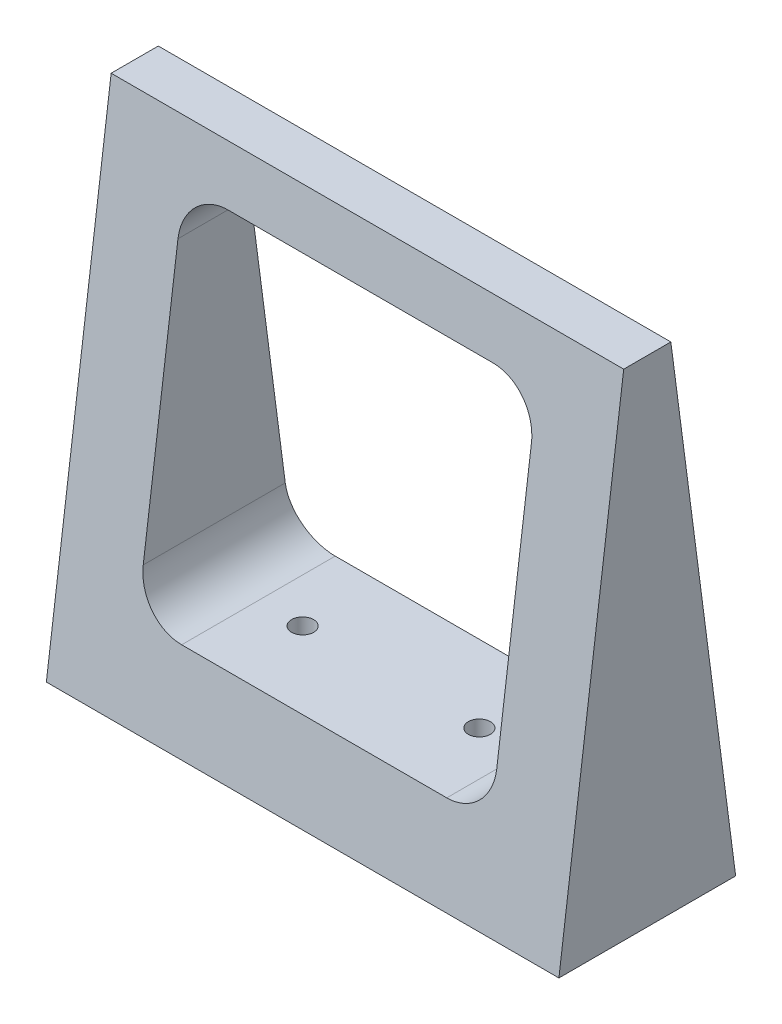
ISO-10303-21;
HEADER;
FILE_DESCRIPTION(('STEP AP214'),'2;1');
FILE_NAME('part.step','',(''),(''),'','','');
FILE_SCHEMA(('AUTOMOTIVE_DESIGN { 1 0 10303 214 1 1 1 1 }'));
ENDSEC;
DATA;
#1=APPLICATION_CONTEXT('core data for automotive mechanical design processes');
#2=APPLICATION_PROTOCOL_DEFINITION('international standard','automotive_design',2000,#1);
#3=PRODUCT_CONTEXT('',#1,'mechanical');
#4=PRODUCT('Part','Part','',(#3));
#5=PRODUCT_RELATED_PRODUCT_CATEGORY('part','',(#4));
#6=PRODUCT_DEFINITION_FORMATION('','',#4);
#7=PRODUCT_DEFINITION_CONTEXT('part definition',#1,'design');
#8=PRODUCT_DEFINITION('design','',#6,#7);
#9=PRODUCT_DEFINITION_SHAPE('','',#8);
#10=(LENGTH_UNIT() NAMED_UNIT(*) SI_UNIT(.MILLI.,.METRE.));
#11=(NAMED_UNIT(*) PLANE_ANGLE_UNIT() SI_UNIT($,.RADIAN.));
#12=(NAMED_UNIT(*) SI_UNIT($,.STERADIAN.) SOLID_ANGLE_UNIT());
#13=UNCERTAINTY_MEASURE_WITH_UNIT(LENGTH_MEASURE(1.E-05),#10,'distance_accuracy_value','');
#14=(GEOMETRIC_REPRESENTATION_CONTEXT(3) GLOBAL_UNCERTAINTY_ASSIGNED_CONTEXT((#13)) GLOBAL_UNIT_ASSIGNED_CONTEXT((#10,
#11,#12)) REPRESENTATION_CONTEXT('',''));
#15=CARTESIAN_POINT('',(0.,0.,0.));
#16=DIRECTION('',(0.,0.,1.));
#17=DIRECTION('',(1.,0.,0.));
#18=AXIS2_PLACEMENT_3D('',#15,#16,#17);
#19=CARTESIAN_POINT('',(92.075,177.8,8.46666666666667));
#20=DIRECTION('',(0.,-0.129843798506472,-0.991534461322152));
#21=DIRECTION('',(0.,0.991534461322152,-0.129843798506472));
#22=AXIS2_PLACEMENT_3D('',#19,#20,#21);
#23=PLANE('',#22);
#24=DIRECTION('',(-1.,0.,0.));
#25=VECTOR('',#24,1.);
#26=CARTESIAN_POINT('',(92.075,31.75,27.5922619047619));
#27=LINE('',#26,#25);
#28=CARTESIAN_POINT('',(47.625,31.75,27.5922619047619));
#29=VERTEX_POINT('',#28);
#30=CARTESIAN_POINT('',(-47.625,31.75,27.5922619047619));
#31=VERTEX_POINT('',#30);
#32=EDGE_CURVE('E175',#29,#31,#27,.T.);
#33=ORIENTED_EDGE('',*,*,#32,.T.);
#34=CARTESIAN_POINT('',(-47.625,47.625,25.5133928571429));
#35=DIRECTION('',(0.,-0.129843798506472,-0.991534461322152));
#36=DIRECTION('',(0.,-0.991534461322152,0.129843798506472));
#37=AXIS2_PLACEMENT_3D('',#34,#35,#36);
#38=ELLIPSE('',#37,16.0105378272296,15.875);
#39=CARTESIAN_POINT('',(-63.5,47.625,25.5133928571428));
#40=VERTEX_POINT('',#39);
#41=EDGE_CURVE('E138',#31,#40,#38,.T.);
#42=ORIENTED_EDGE('',*,*,#41,.T.);
#43=DIRECTION('',(0.,0.991534461322152,-0.129843798506472));
#44=VECTOR('',#43,1.);
#45=CARTESIAN_POINT('',(-63.5,177.8,8.46666666666667));
#46=LINE('',#45,#44);
#47=CARTESIAN_POINT('',(-63.5,142.875,13.0401785714286));
#48=VERTEX_POINT('',#47);
#49=EDGE_CURVE('E204',#40,#48,#46,.T.);
#50=ORIENTED_EDGE('',*,*,#49,.T.);
#51=CARTESIAN_POINT('',(-47.625,142.875,13.0401785714286));
#52=DIRECTION('',(0.,-0.129843798506472,-0.991534461322152));
#53=DIRECTION('',(0.,-0.991534461322152,0.129843798506472));
#54=AXIS2_PLACEMENT_3D('',#51,#52,#53);
#55=ELLIPSE('',#54,16.0105378272296,15.875);
#56=CARTESIAN_POINT('',(-47.625,158.75,10.9613095238095));
#57=VERTEX_POINT('',#56);
#58=EDGE_CURVE('E203',#48,#57,#55,.T.);
#59=ORIENTED_EDGE('',*,*,#58,.T.);
#60=DIRECTION('',(1.,0.,0.));
#61=VECTOR('',#60,1.);
#62=CARTESIAN_POINT('',(92.075,158.75,10.9613095238095));
#63=LINE('',#62,#61);
#64=CARTESIAN_POINT('',(47.625,158.75,10.9613095238095));
#65=VERTEX_POINT('',#64);
#66=EDGE_CURVE('E196',#57,#65,#63,.T.);
#67=ORIENTED_EDGE('',*,*,#66,.T.);
#68=CARTESIAN_POINT('',(47.625,142.875,13.0401785714286));
#69=DIRECTION('',(0.,-0.129843798506472,-0.991534461322152));
#70=DIRECTION('',(0.,-0.991534461322152,0.129843798506472));
#71=AXIS2_PLACEMENT_3D('',#68,#69,#70);
#72=ELLIPSE('',#71,16.0105378272296,15.875);
#73=CARTESIAN_POINT('',(63.5,142.875,13.0401785714286));
#74=VERTEX_POINT('',#73);
#75=EDGE_CURVE('E193',#65,#74,#72,.T.);
#76=ORIENTED_EDGE('',*,*,#75,.T.);
#77=DIRECTION('',(0.,-0.991534461322152,0.129843798506472));
#78=VECTOR('',#77,1.);
#79=CARTESIAN_POINT('',(63.5,177.8,8.46666666666667));
#80=LINE('',#79,#78);
#81=CARTESIAN_POINT('',(63.5,47.625,25.5133928571428));
#82=VERTEX_POINT('',#81);
#83=EDGE_CURVE('E194',#74,#82,#80,.T.);
#84=ORIENTED_EDGE('',*,*,#83,.T.);
#85=CARTESIAN_POINT('',(47.625,47.625,25.5133928571429));
#86=DIRECTION('',(0.,-0.129843798506472,-0.991534461322152));
#87=DIRECTION('',(0.,-0.991534461322152,0.129843798506472));
#88=AXIS2_PLACEMENT_3D('',#85,#86,#87);
#89=ELLIPSE('',#88,16.0105378272296,15.875);
#90=EDGE_CURVE('E188',#82,#29,#89,.T.);
#91=ORIENTED_EDGE('',*,*,#90,.T.);
#92=EDGE_LOOP('',(#33,#42,#50,#59,#67,#76,#84,#91));
#93=FACE_BOUND('',#92,.T.);
#94=DIRECTION('',(0.,-0.991534461322152,0.129843798506472));
#95=VECTOR('',#94,1.);
#96=CARTESIAN_POINT('',(-92.075,177.8,8.46666666666667));
#97=LINE('',#96,#95);
#98=CARTESIAN_POINT('',(-92.075,177.8,8.46666666666667));
#99=VERTEX_POINT('',#98);
#100=CARTESIAN_POINT('',(-92.075,0.,31.75));
#101=VERTEX_POINT('',#100);
#102=EDGE_CURVE('E208',#99,#101,#97,.T.);
#103=ORIENTED_EDGE('',*,*,#102,.T.);
#104=DIRECTION('',(-1.,0.,0.));
#105=VECTOR('',#104,1.);
#106=CARTESIAN_POINT('',(92.075,0.,31.75));
#107=LINE('',#106,#105);
#108=CARTESIAN_POINT('',(92.075,0.,31.75));
#109=VERTEX_POINT('',#108);
#110=EDGE_CURVE('E132',#109,#101,#107,.T.);
#111=ORIENTED_EDGE('',*,*,#110,.F.);
#112=DIRECTION('',(0.,-0.991534461322152,0.129843798506472));
#113=VECTOR('',#112,1.);
#114=CARTESIAN_POINT('',(92.075,177.8,8.46666666666667));
#115=LINE('',#114,#113);
#116=CARTESIAN_POINT('',(92.075,177.8,8.46666666666667));
#117=VERTEX_POINT('',#116);
#118=EDGE_CURVE('E207',#117,#109,#115,.T.);
#119=ORIENTED_EDGE('',*,*,#118,.F.);
#120=DIRECTION('',(-1.,0.,0.));
#121=VECTOR('',#120,1.);
#122=CARTESIAN_POINT('',(92.075,177.8,8.46666666666667));
#123=LINE('',#122,#121);
#124=EDGE_CURVE('E218',#117,#99,#123,.T.);
#125=ORIENTED_EDGE('',*,*,#124,.T.);
#126=EDGE_LOOP('',(#103,#111,#119,#125));
#127=FACE_BOUND('',#126,.T.);
#128=ADVANCED_FACE('F41',(#93,#127),#23,.F.);
#129=CARTESIAN_POINT('',(92.075,0.,31.75));
#130=DIRECTION('',(0.,1.,0.));
#131=DIRECTION('',(0.,0.,1.));
#132=AXIS2_PLACEMENT_3D('',#129,#130,#131);
#133=PLANE('',#132);
#134=CARTESIAN_POINT('',(-31.75,0.,0.));
#135=DIRECTION('',(0.,1.,0.));
#136=DIRECTION('',(0.,0.,1.));
#137=AXIS2_PLACEMENT_3D('',#134,#135,#136);
#138=CIRCLE('',#137,3.96875);
#139=CARTESIAN_POINT('',(-31.75,0.,3.96875));
#140=VERTEX_POINT('',#139);
#141=EDGE_CURVE('E142',#140,#140,#138,.T.);
#142=ORIENTED_EDGE('',*,*,#141,.T.);
#143=EDGE_LOOP('',(#142));
#144=FACE_BOUND('',#143,.T.);
#145=CARTESIAN_POINT('',(31.75,0.,0.));
#146=DIRECTION('',(0.,1.,0.));
#147=DIRECTION('',(0.,0.,1.));
#148=AXIS2_PLACEMENT_3D('',#145,#146,#147);
#149=CIRCLE('',#148,3.96875);
#150=CARTESIAN_POINT('',(31.75,0.,3.96875));
#151=VERTEX_POINT('',#150);
#152=EDGE_CURVE('E157',#151,#151,#149,.T.);
#153=ORIENTED_EDGE('',*,*,#152,.T.);
#154=EDGE_LOOP('',(#153));
#155=FACE_BOUND('',#154,.T.);
#156=DIRECTION('',(0.,0.,-1.));
#157=VECTOR('',#156,1.);
#158=CARTESIAN_POINT('',(-92.075,0.,31.75));
#159=LINE('',#158,#157);
#160=CARTESIAN_POINT('',(-92.075,0.,-31.75));
#161=VERTEX_POINT('',#160);
#162=EDGE_CURVE('E225',#101,#161,#159,.T.);
#163=ORIENTED_EDGE('',*,*,#162,.T.);
#164=DIRECTION('',(-1.,0.,0.));
#165=VECTOR('',#164,1.);
#166=CARTESIAN_POINT('',(92.075,0.,-31.75));
#167=LINE('',#166,#165);
#168=CARTESIAN_POINT('',(92.075,0.,-31.75));
#169=VERTEX_POINT('',#168);
#170=EDGE_CURVE('E234',#169,#161,#167,.T.);
#171=ORIENTED_EDGE('',*,*,#170,.F.);
#172=DIRECTION('',(0.,0.,-1.));
#173=VECTOR('',#172,1.);
#174=CARTESIAN_POINT('',(92.075,0.,31.75));
#175=LINE('',#174,#173);
#176=EDGE_CURVE('E215',#109,#169,#175,.T.);
#177=ORIENTED_EDGE('',*,*,#176,.F.);
#178=ORIENTED_EDGE('',*,*,#110,.T.);
#179=EDGE_LOOP('',(#163,#171,#177,#178));
#180=FACE_BOUND('',#179,.T.);
#181=ADVANCED_FACE('F267',(#144,#155,#180),#133,.F.);
#182=CARTESIAN_POINT('',(92.075,0.,-31.75));
#183=DIRECTION('',(0.,-0.129843798506472,0.991534461322152));
#184=DIRECTION('',(0.,-0.991534461322152,-0.129843798506472));
#185=AXIS2_PLACEMENT_3D('',#182,#183,#184);
#186=PLANE('',#185);
#187=DIRECTION('',(0.,-0.991534461322152,-0.129843798506472));
#188=VECTOR('',#187,1.);
#189=CARTESIAN_POINT('',(-63.5,0.,-31.75));
#190=LINE('',#189,#188);
#191=CARTESIAN_POINT('',(-63.5,142.875,-13.0401785714286));
#192=VERTEX_POINT('',#191);
#193=CARTESIAN_POINT('',(-63.5,47.625,-25.5133928571429));
#194=VERTEX_POINT('',#193);
#195=EDGE_CURVE('E47',#192,#194,#190,.T.);
#196=ORIENTED_EDGE('',*,*,#195,.T.);
#197=CARTESIAN_POINT('',(-47.625,47.625,-25.5133928571429));
#198=DIRECTION('',(0.,-0.129843798506472,0.991534461322152));
#199=DIRECTION('',(0.,0.991534461322152,0.129843798506472));
#200=AXIS2_PLACEMENT_3D('',#197,#198,#199);
#201=ELLIPSE('',#200,16.0105378272296,15.875);
#202=CARTESIAN_POINT('',(-47.625,31.75,-27.5922619047619));
#203=VERTEX_POINT('',#202);
#204=EDGE_CURVE('E11',#194,#203,#201,.T.);
#205=ORIENTED_EDGE('',*,*,#204,.T.);
#206=DIRECTION('',(1.,0.,0.));
#207=VECTOR('',#206,1.);
#208=CARTESIAN_POINT('',(92.075,31.75,-27.5922619047619));
#209=LINE('',#208,#207);
#210=CARTESIAN_POINT('',(47.625,31.75,-27.5922619047619));
#211=VERTEX_POINT('',#210);
#212=EDGE_CURVE('E126',#203,#211,#209,.T.);
#213=ORIENTED_EDGE('',*,*,#212,.T.);
#214=CARTESIAN_POINT('',(47.625,47.625,-25.5133928571429));
#215=DIRECTION('',(0.,-0.129843798506472,0.991534461322152));
#216=DIRECTION('',(0.,0.991534461322152,0.129843798506472));
#217=AXIS2_PLACEMENT_3D('',#214,#215,#216);
#218=ELLIPSE('',#217,16.0105378272296,15.875);
#219=CARTESIAN_POINT('',(63.5,47.625,-25.5133928571429));
#220=VERTEX_POINT('',#219);
#221=EDGE_CURVE('E135',#211,#220,#218,.T.);
#222=ORIENTED_EDGE('',*,*,#221,.T.);
#223=DIRECTION('',(0.,0.991534461322152,0.129843798506472));
#224=VECTOR('',#223,1.);
#225=CARTESIAN_POINT('',(63.5,0.,-31.75));
#226=LINE('',#225,#224);
#227=CARTESIAN_POINT('',(63.5,142.875,-13.0401785714286));
#228=VERTEX_POINT('',#227);
#229=EDGE_CURVE('E236',#220,#228,#226,.T.);
#230=ORIENTED_EDGE('',*,*,#229,.T.);
#231=CARTESIAN_POINT('',(47.625,142.875,-13.0401785714286));
#232=DIRECTION('',(0.,-0.129843798506472,0.991534461322152));
#233=DIRECTION('',(0.,0.991534461322152,0.129843798506472));
#234=AXIS2_PLACEMENT_3D('',#231,#232,#233);
#235=ELLIPSE('',#234,16.0105378272296,15.875);
#236=CARTESIAN_POINT('',(47.625,158.75,-10.9613095238095));
#237=VERTEX_POINT('',#236);
#238=EDGE_CURVE('E241',#228,#237,#235,.T.);
#239=ORIENTED_EDGE('',*,*,#238,.T.);
#240=DIRECTION('',(-1.,0.,0.));
#241=VECTOR('',#240,1.);
#242=CARTESIAN_POINT('',(92.075,158.75,-10.9613095238095));
#243=LINE('',#242,#241);
#244=CARTESIAN_POINT('',(-47.625,158.75,-10.9613095238096));
#245=VERTEX_POINT('',#244);
#246=EDGE_CURVE('E152',#237,#245,#243,.T.);
#247=ORIENTED_EDGE('',*,*,#246,.T.);
#248=CARTESIAN_POINT('',(-47.625,142.875,-13.0401785714286));
#249=DIRECTION('',(0.,-0.129843798506472,0.991534461322152));
#250=DIRECTION('',(0.,0.991534461322152,0.129843798506472));
#251=AXIS2_PLACEMENT_3D('',#248,#249,#250);
#252=ELLIPSE('',#251,16.0105378272296,15.875);
#253=EDGE_CURVE('E149',#245,#192,#252,.T.);
#254=ORIENTED_EDGE('',*,*,#253,.T.);
#255=EDGE_LOOP('',(#196,#205,#213,#222,#230,#239,#247,#254));
#256=FACE_BOUND('',#255,.T.);
#257=DIRECTION('',(0.,0.991534461322152,0.129843798506472));
#258=VECTOR('',#257,1.);
#259=CARTESIAN_POINT('',(-92.075,0.,-31.75));
#260=LINE('',#259,#258);
#261=CARTESIAN_POINT('',(-92.075,177.8,-8.46666666666667));
#262=VERTEX_POINT('',#261);
#263=EDGE_CURVE('E221',#161,#262,#260,.T.);
#264=ORIENTED_EDGE('',*,*,#263,.T.);
#265=DIRECTION('',(-1.,0.,0.));
#266=VECTOR('',#265,1.);
#267=CARTESIAN_POINT('',(92.075,177.8,-8.46666666666667));
#268=LINE('',#267,#266);
#269=CARTESIAN_POINT('',(92.075,177.8,-8.46666666666667));
#270=VERTEX_POINT('',#269);
#271=EDGE_CURVE('E228',#270,#262,#268,.T.);
#272=ORIENTED_EDGE('',*,*,#271,.F.);
#273=DIRECTION('',(0.,0.991534461322152,0.129843798506472));
#274=VECTOR('',#273,1.);
#275=CARTESIAN_POINT('',(92.075,0.,-31.75));
#276=LINE('',#275,#274);
#277=EDGE_CURVE('E214',#169,#270,#276,.T.);
#278=ORIENTED_EDGE('',*,*,#277,.F.);
#279=ORIENTED_EDGE('',*,*,#170,.T.);
#280=EDGE_LOOP('',(#264,#272,#278,#279));
#281=FACE_BOUND('',#280,.T.);
#282=ADVANCED_FACE('F144',(#256,#281),#186,.F.);
#283=CARTESIAN_POINT('',(92.075,177.8,-8.46666666666667));
#284=DIRECTION('',(0.,-1.,0.));
#285=DIRECTION('',(0.,0.,-1.));
#286=AXIS2_PLACEMENT_3D('',#283,#284,#285);
#287=PLANE('',#286);
#288=DIRECTION('',(0.,0.,1.));
#289=VECTOR('',#288,1.);
#290=CARTESIAN_POINT('',(-92.075,177.8,-8.46666666666667));
#291=LINE('',#290,#289);
#292=EDGE_CURVE('E213',#262,#99,#291,.T.);
#293=ORIENTED_EDGE('',*,*,#292,.T.);
#294=ORIENTED_EDGE('',*,*,#124,.F.);
#295=DIRECTION('',(0.,0.,1.));
#296=VECTOR('',#295,1.);
#297=CARTESIAN_POINT('',(92.075,177.8,-8.46666666666667));
#298=LINE('',#297,#296);
#299=EDGE_CURVE('E220',#270,#117,#298,.T.);
#300=ORIENTED_EDGE('',*,*,#299,.F.);
#301=ORIENTED_EDGE('',*,*,#271,.T.);
#302=EDGE_LOOP('',(#293,#294,#300,#301));
#303=FACE_BOUND('',#302,.T.);
#304=ADVANCED_FACE('F276',(#303),#287,.F.);
#305=CARTESIAN_POINT('',(92.075,0.,0.));
#306=DIRECTION('',(1.,0.,0.));
#307=DIRECTION('',(0.,0.,-1.));
#308=AXIS2_PLACEMENT_3D('',#305,#306,#307);
#309=PLANE('',#308);
#310=ORIENTED_EDGE('',*,*,#118,.T.);
#311=ORIENTED_EDGE('',*,*,#176,.T.);
#312=ORIENTED_EDGE('',*,*,#277,.T.);
#313=ORIENTED_EDGE('',*,*,#299,.T.);
#314=EDGE_LOOP('',(#310,#311,#312,#313));
#315=FACE_BOUND('',#314,.T.);
#316=ADVANCED_FACE('F283',(#315),#309,.T.);
#317=CARTESIAN_POINT('',(-92.075,0.,0.));
#318=DIRECTION('',(1.,0.,0.));
#319=DIRECTION('',(0.,0.,-1.));
#320=AXIS2_PLACEMENT_3D('',#317,#318,#319);
#321=PLANE('',#320);
#322=ORIENTED_EDGE('',*,*,#102,.F.);
#323=ORIENTED_EDGE('',*,*,#292,.F.);
#324=ORIENTED_EDGE('',*,*,#263,.F.);
#325=ORIENTED_EDGE('',*,*,#162,.F.);
#326=EDGE_LOOP('',(#322,#323,#324,#325));
#327=FACE_BOUND('',#326,.T.);
#328=ADVANCED_FACE('F287',(#327),#321,.F.);
#329=CARTESIAN_POINT('',(-47.625,47.625,-79.375));
#330=DIRECTION('',(0.,0.,1.));
#331=DIRECTION('',(1.,0.,0.));
#332=AXIS2_PLACEMENT_3D('',#329,#330,#331);
#333=CYLINDRICAL_SURFACE('',#332,15.875);
#334=DIRECTION('',(0.,0.,1.));
#335=VECTOR('',#334,1.);
#336=CARTESIAN_POINT('',(-47.625,31.75,-79.375));
#337=LINE('',#336,#335);
#338=EDGE_CURVE('E60',#203,#31,#337,.T.);
#339=ORIENTED_EDGE('',*,*,#338,.F.);
#340=ORIENTED_EDGE('',*,*,#204,.F.);
#341=DIRECTION('',(0.,0.,1.));
#342=VECTOR('',#341,1.);
#343=CARTESIAN_POINT('',(-63.5,47.625,-79.375));
#344=LINE('',#343,#342);
#345=EDGE_CURVE('E168',#194,#40,#344,.T.);
#346=ORIENTED_EDGE('',*,*,#345,.T.);
#347=ORIENTED_EDGE('',*,*,#41,.F.);
#348=EDGE_LOOP('',(#339,#340,#346,#347));
#349=FACE_BOUND('',#348,.T.);
#350=ADVANCED_FACE('F137',(#349),#333,.F.);
#351=CARTESIAN_POINT('',(-63.5,142.875,-79.375));
#352=DIRECTION('',(-1.,0.,0.));
#353=DIRECTION('',(0.,0.,1.));
#354=AXIS2_PLACEMENT_3D('',#351,#352,#353);
#355=PLANE('',#354);
#356=ORIENTED_EDGE('',*,*,#345,.F.);
#357=ORIENTED_EDGE('',*,*,#195,.F.);
#358=DIRECTION('',(0.,0.,1.));
#359=VECTOR('',#358,1.);
#360=CARTESIAN_POINT('',(-63.5,142.875,-79.375));
#361=LINE('',#360,#359);
#362=EDGE_CURVE('E172',#192,#48,#361,.T.);
#363=ORIENTED_EDGE('',*,*,#362,.T.);
#364=ORIENTED_EDGE('',*,*,#49,.F.);
#365=EDGE_LOOP('',(#356,#357,#363,#364));
#366=FACE_BOUND('',#365,.T.);
#367=ADVANCED_FACE('F255',(#366),#355,.F.);
#368=CARTESIAN_POINT('',(-47.625,142.875,-79.375));
#369=DIRECTION('',(0.,0.,1.));
#370=DIRECTION('',(1.,0.,0.));
#371=AXIS2_PLACEMENT_3D('',#368,#369,#370);
#372=CYLINDRICAL_SURFACE('',#371,15.875);
#373=ORIENTED_EDGE('',*,*,#362,.F.);
#374=ORIENTED_EDGE('',*,*,#253,.F.);
#375=DIRECTION('',(0.,0.,1.));
#376=VECTOR('',#375,1.);
#377=CARTESIAN_POINT('',(-47.625,158.75,-79.375));
#378=LINE('',#377,#376);
#379=EDGE_CURVE('E174',#245,#57,#378,.T.);
#380=ORIENTED_EDGE('',*,*,#379,.T.);
#381=ORIENTED_EDGE('',*,*,#58,.F.);
#382=EDGE_LOOP('',(#373,#374,#380,#381));
#383=FACE_BOUND('',#382,.T.);
#384=ADVANCED_FACE('F251',(#383),#372,.F.);
#385=CARTESIAN_POINT('',(47.625,158.75,-79.375));
#386=DIRECTION('',(0.,1.,0.));
#387=DIRECTION('',(0.,0.,1.));
#388=AXIS2_PLACEMENT_3D('',#385,#386,#387);
#389=PLANE('',#388);
#390=ORIENTED_EDGE('',*,*,#379,.F.);
#391=ORIENTED_EDGE('',*,*,#246,.F.);
#392=DIRECTION('',(0.,0.,1.));
#393=VECTOR('',#392,1.);
#394=CARTESIAN_POINT('',(47.625,158.75,-79.375));
#395=LINE('',#394,#393);
#396=EDGE_CURVE('E180',#237,#65,#395,.T.);
#397=ORIENTED_EDGE('',*,*,#396,.T.);
#398=ORIENTED_EDGE('',*,*,#66,.F.);
#399=EDGE_LOOP('',(#390,#391,#397,#398));
#400=FACE_BOUND('',#399,.T.);
#401=ADVANCED_FACE('F247',(#400),#389,.F.);
#402=CARTESIAN_POINT('',(47.625,142.875,-79.375));
#403=DIRECTION('',(0.,0.,1.));
#404=DIRECTION('',(1.,0.,0.));
#405=AXIS2_PLACEMENT_3D('',#402,#403,#404);
#406=CYLINDRICAL_SURFACE('',#405,15.875);
#407=ORIENTED_EDGE('',*,*,#396,.F.);
#408=ORIENTED_EDGE('',*,*,#238,.F.);
#409=DIRECTION('',(0.,0.,1.));
#410=VECTOR('',#409,1.);
#411=CARTESIAN_POINT('',(63.5,142.875,-79.375));
#412=LINE('',#411,#410);
#413=EDGE_CURVE('E182',#228,#74,#412,.T.);
#414=ORIENTED_EDGE('',*,*,#413,.T.);
#415=ORIENTED_EDGE('',*,*,#75,.F.);
#416=EDGE_LOOP('',(#407,#408,#414,#415));
#417=FACE_BOUND('',#416,.T.);
#418=ADVANCED_FACE('F250',(#417),#406,.F.);
#419=CARTESIAN_POINT('',(63.5,47.625,-79.375));
#420=DIRECTION('',(1.,0.,0.));
#421=DIRECTION('',(0.,0.,-1.));
#422=AXIS2_PLACEMENT_3D('',#419,#420,#421);
#423=PLANE('',#422);
#424=ORIENTED_EDGE('',*,*,#413,.F.);
#425=ORIENTED_EDGE('',*,*,#229,.F.);
#426=DIRECTION('',(0.,0.,1.));
#427=VECTOR('',#426,1.);
#428=CARTESIAN_POINT('',(63.5,47.625,-79.375));
#429=LINE('',#428,#427);
#430=EDGE_CURVE('E184',#220,#82,#429,.T.);
#431=ORIENTED_EDGE('',*,*,#430,.T.);
#432=ORIENTED_EDGE('',*,*,#83,.F.);
#433=EDGE_LOOP('',(#424,#425,#431,#432));
#434=FACE_BOUND('',#433,.T.);
#435=ADVANCED_FACE('F259',(#434),#423,.F.);
#436=CARTESIAN_POINT('',(47.625,47.625,-79.375));
#437=DIRECTION('',(0.,0.,1.));
#438=DIRECTION('',(1.,0.,0.));
#439=AXIS2_PLACEMENT_3D('',#436,#437,#438);
#440=CYLINDRICAL_SURFACE('',#439,15.875);
#441=ORIENTED_EDGE('',*,*,#430,.F.);
#442=ORIENTED_EDGE('',*,*,#221,.F.);
#443=DIRECTION('',(0.,0.,1.));
#444=VECTOR('',#443,1.);
#445=CARTESIAN_POINT('',(47.625,31.75,-79.375));
#446=LINE('',#445,#444);
#447=EDGE_CURVE('E65',#211,#29,#446,.T.);
#448=ORIENTED_EDGE('',*,*,#447,.T.);
#449=ORIENTED_EDGE('',*,*,#90,.F.);
#450=EDGE_LOOP('',(#441,#442,#448,#449));
#451=FACE_BOUND('',#450,.T.);
#452=ADVANCED_FACE('F260',(#451),#440,.F.);
#453=CARTESIAN_POINT('',(-47.625,31.75,-79.375));
#454=DIRECTION('',(0.,-1.,0.));
#455=DIRECTION('',(0.,0.,-1.));
#456=AXIS2_PLACEMENT_3D('',#453,#454,#455);
#457=PLANE('',#456);
#458=CARTESIAN_POINT('',(-31.75,31.75,0.));
#459=DIRECTION('',(0.,-1.,0.));
#460=DIRECTION('',(0.,0.,-1.));
#461=AXIS2_PLACEMENT_3D('',#458,#459,#460);
#462=CIRCLE('',#461,3.96875);
#463=CARTESIAN_POINT('',(-31.75,31.75,-3.96875));
#464=VERTEX_POINT('',#463);
#465=EDGE_CURVE('E42',#464,#464,#462,.T.);
#466=ORIENTED_EDGE('',*,*,#465,.T.);
#467=EDGE_LOOP('',(#466));
#468=FACE_BOUND('',#467,.T.);
#469=CARTESIAN_POINT('',(31.75,31.75,0.));
#470=DIRECTION('',(0.,-1.,0.));
#471=DIRECTION('',(0.,0.,-1.));
#472=AXIS2_PLACEMENT_3D('',#469,#470,#471);
#473=CIRCLE('',#472,3.96875);
#474=CARTESIAN_POINT('',(31.75,31.75,-3.96875));
#475=VERTEX_POINT('',#474);
#476=EDGE_CURVE('E160',#475,#475,#473,.T.);
#477=ORIENTED_EDGE('',*,*,#476,.T.);
#478=EDGE_LOOP('',(#477));
#479=FACE_BOUND('',#478,.T.);
#480=ORIENTED_EDGE('',*,*,#447,.F.);
#481=ORIENTED_EDGE('',*,*,#212,.F.);
#482=ORIENTED_EDGE('',*,*,#338,.T.);
#483=ORIENTED_EDGE('',*,*,#32,.F.);
#484=EDGE_LOOP('',(#480,#481,#482,#483));
#485=FACE_BOUND('',#484,.T.);
#486=ADVANCED_FACE('F129',(#468,#479,#485),#457,.F.);
#487=CARTESIAN_POINT('',(31.75,-40.,0.));
#488=DIRECTION('',(0.,1.,0.));
#489=DIRECTION('',(0.,0.,1.));
#490=AXIS2_PLACEMENT_3D('',#487,#488,#489);
#491=CYLINDRICAL_SURFACE('',#490,3.96875);
#492=ORIENTED_EDGE('',*,*,#476,.F.);
#493=EDGE_LOOP('',(#492));
#494=FACE_BOUND('',#493,.T.);
#495=ORIENTED_EDGE('',*,*,#152,.F.);
#496=EDGE_LOOP('',(#495));
#497=FACE_BOUND('',#496,.T.);
#498=ADVANCED_FACE('F294',(#494,#497),#491,.F.);
#499=CARTESIAN_POINT('',(-31.75,-40.,0.));
#500=DIRECTION('',(0.,1.,0.));
#501=DIRECTION('',(0.,0.,1.));
#502=AXIS2_PLACEMENT_3D('',#499,#500,#501);
#503=CYLINDRICAL_SURFACE('',#502,3.96875);
#504=ORIENTED_EDGE('',*,*,#465,.F.);
#505=EDGE_LOOP('',(#504));
#506=FACE_BOUND('',#505,.T.);
#507=ORIENTED_EDGE('',*,*,#141,.F.);
#508=EDGE_LOOP('',(#507));
#509=FACE_BOUND('',#508,.T.);
#510=ADVANCED_FACE('F298',(#506,#509),#503,.F.);
#511=CLOSED_SHELL('',(#128,#181,#282,#304,#316,#328,#350,#367,#384,#401,#418,#435,#452,#486,
#498,#510));
#512=MANIFOLD_SOLID_BREP('B2',#511);
#513=ADVANCED_BREP_SHAPE_REPRESENTATION('',(#18,#512),#14);
#514=SHAPE_DEFINITION_REPRESENTATION(#9,#513);
ENDSEC;
END-ISO-10303-21;
